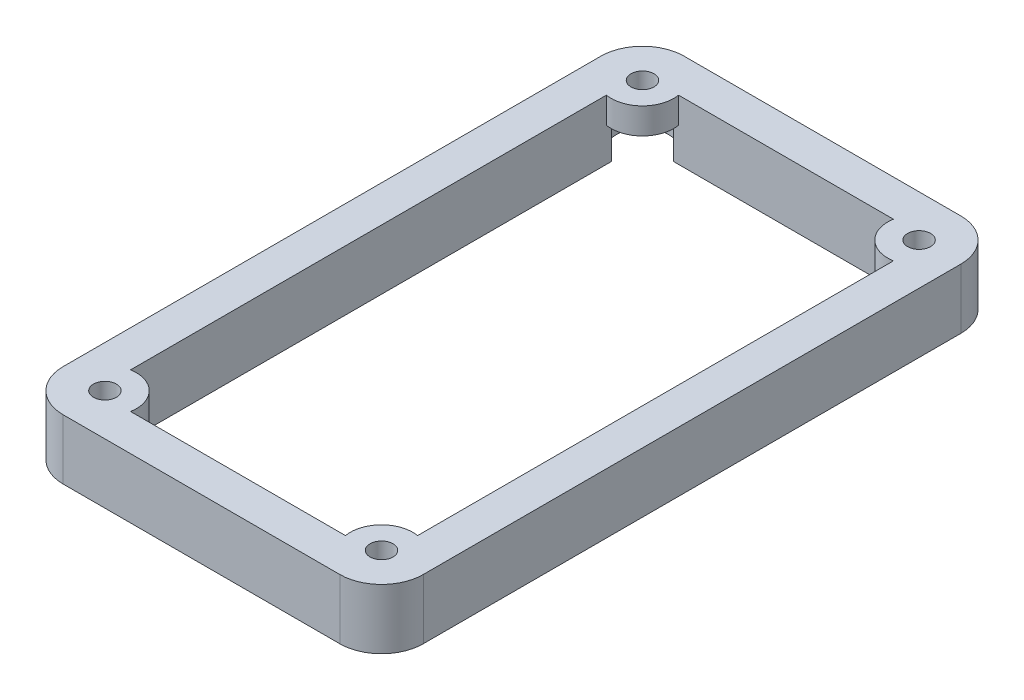
ISO-10303-21;
HEADER;
FILE_DESCRIPTION(('STEP AP214'),'2;1');
FILE_NAME('part.step','',(''),(''),'','','');
FILE_SCHEMA(('AUTOMOTIVE_DESIGN { 1 0 10303 214 1 1 1 1 }'));
ENDSEC;
DATA;
#1=APPLICATION_CONTEXT('core data for automotive mechanical design processes');
#2=APPLICATION_PROTOCOL_DEFINITION('international standard','automotive_design',2000,#1);
#3=PRODUCT_CONTEXT('',#1,'mechanical');
#4=PRODUCT('Part','Part','',(#3));
#5=PRODUCT_RELATED_PRODUCT_CATEGORY('part','',(#4));
#6=PRODUCT_DEFINITION_FORMATION('','',#4);
#7=PRODUCT_DEFINITION_CONTEXT('part definition',#1,'design');
#8=PRODUCT_DEFINITION('design','',#6,#7);
#9=PRODUCT_DEFINITION_SHAPE('','',#8);
#10=(LENGTH_UNIT() NAMED_UNIT(*) SI_UNIT(.MILLI.,.METRE.));
#11=(NAMED_UNIT(*) PLANE_ANGLE_UNIT() SI_UNIT($,.RADIAN.));
#12=(NAMED_UNIT(*) SI_UNIT($,.STERADIAN.) SOLID_ANGLE_UNIT());
#13=UNCERTAINTY_MEASURE_WITH_UNIT(LENGTH_MEASURE(1.E-05),#10,'distance_accuracy_value','');
#14=(GEOMETRIC_REPRESENTATION_CONTEXT(3) GLOBAL_UNCERTAINTY_ASSIGNED_CONTEXT((#13)) GLOBAL_UNIT_ASSIGNED_CONTEXT((#10,
#11,#12)) REPRESENTATION_CONTEXT('',''));
#15=CARTESIAN_POINT('',(0.,0.,0.));
#16=DIRECTION('',(0.,0.,1.));
#17=DIRECTION('',(1.,0.,0.));
#18=AXIS2_PLACEMENT_3D('',#15,#16,#17);
#19=CARTESIAN_POINT('',(-26.5,0.,-51.5));
#20=DIRECTION('',(0.,1.,0.));
#21=DIRECTION('',(0.,0.,1.));
#22=AXIS2_PLACEMENT_3D('',#19,#20,#21);
#23=CYLINDRICAL_SURFACE('',#22,2.2);
#24=CARTESIAN_POINT('',(-26.5,23.,-51.5));
#25=DIRECTION('',(0.,1.,0.));
#26=DIRECTION('',(0.,0.,1.));
#27=AXIS2_PLACEMENT_3D('',#24,#25,#26);
#28=CIRCLE('',#27,2.2);
#29=CARTESIAN_POINT('',(-26.5,23.,-49.3));
#30=VERTEX_POINT('',#29);
#31=EDGE_CURVE('E400',#30,#30,#28,.T.);
#32=ORIENTED_EDGE('',*,*,#31,.T.);
#33=EDGE_LOOP('',(#32));
#34=FACE_BOUND('',#33,.T.);
#35=CARTESIAN_POINT('',(-26.5,18.,-51.5));
#36=DIRECTION('',(0.,1.,0.));
#37=DIRECTION('',(0.,0.,1.));
#38=AXIS2_PLACEMENT_3D('',#35,#36,#37);
#39=CIRCLE('',#38,2.2);
#40=CARTESIAN_POINT('',(-26.5,18.,-49.3));
#41=VERTEX_POINT('',#40);
#42=EDGE_CURVE('E375',#41,#41,#39,.F.);
#43=ORIENTED_EDGE('',*,*,#42,.T.);
#44=EDGE_LOOP('',(#43));
#45=FACE_BOUND('',#44,.T.);
#46=ADVANCED_FACE('F45',(#34,#45),#23,.F.);
#47=CARTESIAN_POINT('',(26.5,0.,-51.5));
#48=DIRECTION('',(0.,1.,0.));
#49=DIRECTION('',(0.,0.,1.));
#50=AXIS2_PLACEMENT_3D('',#47,#48,#49);
#51=CYLINDRICAL_SURFACE('',#50,2.2);
#52=CARTESIAN_POINT('',(26.5,23.,-51.5));
#53=DIRECTION('',(0.,1.,0.));
#54=DIRECTION('',(0.,0.,1.));
#55=AXIS2_PLACEMENT_3D('',#52,#53,#54);
#56=CIRCLE('',#55,2.2);
#57=CARTESIAN_POINT('',(26.5,23.,-49.3));
#58=VERTEX_POINT('',#57);
#59=EDGE_CURVE('E396',#58,#58,#56,.T.);
#60=ORIENTED_EDGE('',*,*,#59,.T.);
#61=EDGE_LOOP('',(#60));
#62=FACE_BOUND('',#61,.T.);
#63=CARTESIAN_POINT('',(26.5,18.,-51.5));
#64=DIRECTION('',(0.,1.,0.));
#65=DIRECTION('',(0.,0.,1.));
#66=AXIS2_PLACEMENT_3D('',#63,#64,#65);
#67=CIRCLE('',#66,2.2);
#68=CARTESIAN_POINT('',(26.5,18.,-49.3));
#69=VERTEX_POINT('',#68);
#70=EDGE_CURVE('E371',#69,#69,#67,.F.);
#71=ORIENTED_EDGE('',*,*,#70,.T.);
#72=EDGE_LOOP('',(#71));
#73=FACE_BOUND('',#72,.T.);
#74=ADVANCED_FACE('F579',(#62,#73),#51,.F.);
#75=CARTESIAN_POINT('',(26.5,0.,51.5));
#76=DIRECTION('',(0.,1.,0.));
#77=DIRECTION('',(0.,0.,1.));
#78=AXIS2_PLACEMENT_3D('',#75,#76,#77);
#79=CYLINDRICAL_SURFACE('',#78,2.2);
#80=CARTESIAN_POINT('',(26.5,23.,51.5));
#81=DIRECTION('',(0.,1.,0.));
#82=DIRECTION('',(0.,0.,1.));
#83=AXIS2_PLACEMENT_3D('',#80,#81,#82);
#84=CIRCLE('',#83,2.2);
#85=CARTESIAN_POINT('',(26.5,23.,53.7));
#86=VERTEX_POINT('',#85);
#87=EDGE_CURVE('E401',#86,#86,#84,.T.);
#88=ORIENTED_EDGE('',*,*,#87,.T.);
#89=EDGE_LOOP('',(#88));
#90=FACE_BOUND('',#89,.T.);
#91=CARTESIAN_POINT('',(26.5,18.,51.5));
#92=DIRECTION('',(0.,1.,0.));
#93=DIRECTION('',(0.,0.,1.));
#94=AXIS2_PLACEMENT_3D('',#91,#92,#93);
#95=CIRCLE('',#94,2.2);
#96=CARTESIAN_POINT('',(26.5,18.,53.7));
#97=VERTEX_POINT('',#96);
#98=EDGE_CURVE('E367',#97,#97,#95,.F.);
#99=ORIENTED_EDGE('',*,*,#98,.T.);
#100=EDGE_LOOP('',(#99));
#101=FACE_BOUND('',#100,.T.);
#102=ADVANCED_FACE('F586',(#90,#101),#79,.F.);
#103=CARTESIAN_POINT('',(-26.5,0.,51.5));
#104=DIRECTION('',(0.,1.,0.));
#105=DIRECTION('',(0.,0.,1.));
#106=AXIS2_PLACEMENT_3D('',#103,#104,#105);
#107=CYLINDRICAL_SURFACE('',#106,2.2);
#108=CARTESIAN_POINT('',(-26.5,23.,51.5));
#109=DIRECTION('',(0.,1.,0.));
#110=DIRECTION('',(0.,0.,1.));
#111=AXIS2_PLACEMENT_3D('',#108,#109,#110);
#112=CIRCLE('',#111,2.2);
#113=CARTESIAN_POINT('',(-26.5,23.,53.7));
#114=VERTEX_POINT('',#113);
#115=EDGE_CURVE('E395',#114,#114,#112,.T.);
#116=ORIENTED_EDGE('',*,*,#115,.T.);
#117=EDGE_LOOP('',(#116));
#118=FACE_BOUND('',#117,.T.);
#119=CARTESIAN_POINT('',(-26.5,18.,51.5));
#120=DIRECTION('',(0.,1.,0.));
#121=DIRECTION('',(0.,0.,1.));
#122=AXIS2_PLACEMENT_3D('',#119,#120,#121);
#123=CIRCLE('',#122,2.2);
#124=CARTESIAN_POINT('',(-26.5,18.,53.7));
#125=VERTEX_POINT('',#124);
#126=EDGE_CURVE('E471',#125,#125,#123,.F.);
#127=ORIENTED_EDGE('',*,*,#126,.T.);
#128=EDGE_LOOP('',(#127));
#129=FACE_BOUND('',#128,.T.);
#130=ADVANCED_FACE('F592',(#118,#129),#107,.F.);
#131=CARTESIAN_POINT('',(27.5,23.,-52.5));
#132=DIRECTION('',(-1.,0.,0.));
#133=DIRECTION('',(0.,0.,1.));
#134=AXIS2_PLACEMENT_3D('',#131,#132,#133);
#135=PLANE('',#134);
#136=DIRECTION('',(0.,0.,-1.));
#137=VECTOR('',#136,1.);
#138=CARTESIAN_POINT('',(27.5,11.5,-52.5));
#139=LINE('',#138,#137);
#140=CARTESIAN_POINT('',(27.5,11.5,46.6010205144337));
#141=VERTEX_POINT('',#140);
#142=CARTESIAN_POINT('',(27.5,11.5,-46.6010205144337));
#143=VERTEX_POINT('',#142);
#144=EDGE_CURVE('E339',#141,#143,#139,.T.);
#145=ORIENTED_EDGE('',*,*,#144,.F.);
#146=DIRECTION('',(0.,1.,0.));
#147=VECTOR('',#146,1.);
#148=CARTESIAN_POINT('',(27.5,-2.64213562373094,46.6010205144337));
#149=LINE('',#148,#147);
#150=CARTESIAN_POINT('',(27.5,18.,46.6010205144337));
#151=VERTEX_POINT('',#150);
#152=EDGE_CURVE('E61',#141,#151,#149,.T.);
#153=ORIENTED_EDGE('',*,*,#152,.T.);
#154=DIRECTION('',(0.,0.,-1.));
#155=VECTOR('',#154,1.);
#156=CARTESIAN_POINT('',(27.5,18.,52.5));
#157=LINE('',#156,#155);
#158=CARTESIAN_POINT('',(27.5,18.,45.5839202169004));
#159=VERTEX_POINT('',#158);
#160=EDGE_CURVE('E361',#151,#159,#157,.T.);
#161=ORIENTED_EDGE('',*,*,#160,.T.);
#162=DIRECTION('',(0.,1.,0.));
#163=VECTOR('',#162,1.);
#164=CARTESIAN_POINT('',(27.5,-16.9705627484771,45.5839202169004));
#165=LINE('',#164,#163);
#166=CARTESIAN_POINT('',(27.5,23.,45.5839202169004));
#167=VERTEX_POINT('',#166);
#168=EDGE_CURVE('E427',#167,#159,#165,.F.);
#169=ORIENTED_EDGE('',*,*,#168,.F.);
#170=DIRECTION('',(0.,0.,-1.));
#171=VECTOR('',#170,1.);
#172=CARTESIAN_POINT('',(27.5,23.,-52.5));
#173=LINE('',#172,#171);
#174=CARTESIAN_POINT('',(27.5,23.,-45.5839202169004));
#175=VERTEX_POINT('',#174);
#176=EDGE_CURVE('E440',#167,#175,#173,.T.);
#177=ORIENTED_EDGE('',*,*,#176,.T.);
#178=DIRECTION('',(0.,1.,0.));
#179=VECTOR('',#178,1.);
#180=CARTESIAN_POINT('',(27.5,-16.9705627484771,-45.5839202169004));
#181=LINE('',#180,#179);
#182=CARTESIAN_POINT('',(27.5,18.,-45.5839202169004));
#183=VERTEX_POINT('',#182);
#184=EDGE_CURVE('E437',#183,#175,#181,.T.);
#185=ORIENTED_EDGE('',*,*,#184,.F.);
#186=CARTESIAN_POINT('',(27.5,18.,-46.6010205144337));
#187=VERTEX_POINT('',#186);
#188=EDGE_CURVE('E357',#183,#187,#157,.T.);
#189=ORIENTED_EDGE('',*,*,#188,.T.);
#190=DIRECTION('',(0.,1.,0.));
#191=VECTOR('',#190,1.);
#192=CARTESIAN_POINT('',(27.5,-2.64213562373094,-46.6010205144337));
#193=LINE('',#192,#191);
#194=EDGE_CURVE('E315',#187,#143,#193,.F.);
#195=ORIENTED_EDGE('',*,*,#194,.T.);
#196=EDGE_LOOP('',(#145,#153,#161,#169,#177,#185,#189,#195));
#197=FACE_BOUND('',#196,.T.);
#198=ADVANCED_FACE('F509',(#197),#135,.T.);
#199=CARTESIAN_POINT('',(-27.5,23.,-52.5));
#200=DIRECTION('',(0.,0.,1.));
#201=DIRECTION('',(1.,0.,0.));
#202=AXIS2_PLACEMENT_3D('',#199,#200,#201);
#203=PLANE('',#202);
#204=DIRECTION('',(-1.,0.,0.));
#205=VECTOR('',#204,1.);
#206=CARTESIAN_POINT('',(-27.5,11.5,-52.5));
#207=LINE('',#206,#205);
#208=CARTESIAN_POINT('',(21.6010205144336,11.5,-52.5));
#209=VERTEX_POINT('',#208);
#210=CARTESIAN_POINT('',(-21.6010205144336,11.5,-52.5));
#211=VERTEX_POINT('',#210);
#212=EDGE_CURVE('E343',#209,#211,#207,.T.);
#213=ORIENTED_EDGE('',*,*,#212,.F.);
#214=DIRECTION('',(0.,1.,0.));
#215=VECTOR('',#214,1.);
#216=CARTESIAN_POINT('',(21.6010205144336,-2.64213562373094,-52.5));
#217=LINE('',#216,#215);
#218=CARTESIAN_POINT('',(21.6010205144336,18.,-52.5));
#219=VERTEX_POINT('',#218);
#220=EDGE_CURVE('E311',#209,#219,#217,.T.);
#221=ORIENTED_EDGE('',*,*,#220,.T.);
#222=DIRECTION('',(-1.,0.,0.));
#223=VECTOR('',#222,1.);
#224=CARTESIAN_POINT('',(27.5,18.,-52.5));
#225=LINE('',#224,#223);
#226=CARTESIAN_POINT('',(20.5839202169004,18.,-52.5));
#227=VERTEX_POINT('',#226);
#228=EDGE_CURVE('E366',#219,#227,#225,.T.);
#229=ORIENTED_EDGE('',*,*,#228,.T.);
#230=DIRECTION('',(0.,1.,0.));
#231=VECTOR('',#230,1.);
#232=CARTESIAN_POINT('',(20.5839202169004,-16.9705627484771,-52.5));
#233=LINE('',#232,#231);
#234=CARTESIAN_POINT('',(20.5839202169004,23.,-52.5));
#235=VERTEX_POINT('',#234);
#236=EDGE_CURVE('E467',#235,#227,#233,.F.);
#237=ORIENTED_EDGE('',*,*,#236,.F.);
#238=DIRECTION('',(-1.,0.,0.));
#239=VECTOR('',#238,1.);
#240=CARTESIAN_POINT('',(-27.5,23.,-52.5));
#241=LINE('',#240,#239);
#242=CARTESIAN_POINT('',(-20.5839202169004,23.,-52.5));
#243=VERTEX_POINT('',#242);
#244=EDGE_CURVE('E444',#235,#243,#241,.T.);
#245=ORIENTED_EDGE('',*,*,#244,.T.);
#246=DIRECTION('',(0.,1.,0.));
#247=VECTOR('',#246,1.);
#248=CARTESIAN_POINT('',(-20.5839202169004,-16.9705627484771,-52.5));
#249=LINE('',#248,#247);
#250=CARTESIAN_POINT('',(-20.5839202169004,18.,-52.5));
#251=VERTEX_POINT('',#250);
#252=EDGE_CURVE('E434',#251,#243,#249,.T.);
#253=ORIENTED_EDGE('',*,*,#252,.F.);
#254=CARTESIAN_POINT('',(-21.6010205144336,18.,-52.5));
#255=VERTEX_POINT('',#254);
#256=EDGE_CURVE('E362',#251,#255,#225,.T.);
#257=ORIENTED_EDGE('',*,*,#256,.T.);
#258=DIRECTION('',(0.,1.,0.));
#259=VECTOR('',#258,1.);
#260=CARTESIAN_POINT('',(-21.6010205144336,-2.64213562373094,-52.5));
#261=LINE('',#260,#259);
#262=EDGE_CURVE('E307',#255,#211,#261,.F.);
#263=ORIENTED_EDGE('',*,*,#262,.T.);
#264=EDGE_LOOP('',(#213,#221,#229,#237,#245,#253,#257,#263));
#265=FACE_BOUND('',#264,.T.);
#266=ADVANCED_FACE('F513',(#265),#203,.T.);
#267=CARTESIAN_POINT('',(-27.5,23.,-52.5));
#268=DIRECTION('',(1.,0.,0.));
#269=DIRECTION('',(0.,0.,-1.));
#270=AXIS2_PLACEMENT_3D('',#267,#268,#269);
#271=PLANE('',#270);
#272=DIRECTION('',(0.,0.,1.));
#273=VECTOR('',#272,1.);
#274=CARTESIAN_POINT('',(-27.5,18.,52.5));
#275=LINE('',#274,#273);
#276=CARTESIAN_POINT('',(-27.5,18.,45.5839202169004));
#277=VERTEX_POINT('',#276);
#278=CARTESIAN_POINT('',(-27.5,18.,46.6010205144337));
#279=VERTEX_POINT('',#278);
#280=EDGE_CURVE('E347',#277,#279,#275,.T.);
#281=ORIENTED_EDGE('',*,*,#280,.T.);
#282=DIRECTION('',(0.,1.,0.));
#283=VECTOR('',#282,1.);
#284=CARTESIAN_POINT('',(-27.5,-2.64213562373094,46.6010205144337));
#285=LINE('',#284,#283);
#286=CARTESIAN_POINT('',(-27.5,11.5,46.6010205144337));
#287=VERTEX_POINT('',#286);
#288=EDGE_CURVE('E327',#279,#287,#285,.F.);
#289=ORIENTED_EDGE('',*,*,#288,.T.);
#290=DIRECTION('',(0.,0.,1.));
#291=VECTOR('',#290,1.);
#292=CARTESIAN_POINT('',(-27.5,11.5,-52.5));
#293=LINE('',#292,#291);
#294=CARTESIAN_POINT('',(-27.5,11.5,-46.6010205144337));
#295=VERTEX_POINT('',#294);
#296=EDGE_CURVE('E335',#295,#287,#293,.T.);
#297=ORIENTED_EDGE('',*,*,#296,.F.);
#298=DIRECTION('',(0.,1.,0.));
#299=VECTOR('',#298,1.);
#300=CARTESIAN_POINT('',(-27.5,-2.64213562373094,-46.6010205144337));
#301=LINE('',#300,#299);
#302=CARTESIAN_POINT('',(-27.5,18.,-46.6010205144337));
#303=VERTEX_POINT('',#302);
#304=EDGE_CURVE('E303',#295,#303,#301,.T.);
#305=ORIENTED_EDGE('',*,*,#304,.T.);
#306=CARTESIAN_POINT('',(-27.5,18.,-45.5839202169004));
#307=VERTEX_POINT('',#306);
#308=EDGE_CURVE('E351',#303,#307,#275,.T.);
#309=ORIENTED_EDGE('',*,*,#308,.T.);
#310=DIRECTION('',(0.,1.,0.));
#311=VECTOR('',#310,1.);
#312=CARTESIAN_POINT('',(-27.5,-16.9705627484771,-45.5839202169004));
#313=LINE('',#312,#311);
#314=CARTESIAN_POINT('',(-27.5,23.,-45.5839202169004));
#315=VERTEX_POINT('',#314);
#316=EDGE_CURVE('E463',#315,#307,#313,.F.);
#317=ORIENTED_EDGE('',*,*,#316,.F.);
#318=DIRECTION('',(0.,0.,1.));
#319=VECTOR('',#318,1.);
#320=CARTESIAN_POINT('',(-27.5,23.,-52.5));
#321=LINE('',#320,#319);
#322=CARTESIAN_POINT('',(-27.5,23.,45.5839202169004));
#323=VERTEX_POINT('',#322);
#324=EDGE_CURVE('E448',#315,#323,#321,.T.);
#325=ORIENTED_EDGE('',*,*,#324,.T.);
#326=DIRECTION('',(0.,1.,0.));
#327=VECTOR('',#326,1.);
#328=CARTESIAN_POINT('',(-27.5,-16.9705627484771,45.5839202169004));
#329=LINE('',#328,#327);
#330=EDGE_CURVE('E431',#277,#323,#329,.T.);
#331=ORIENTED_EDGE('',*,*,#330,.F.);
#332=EDGE_LOOP('',(#281,#289,#297,#305,#309,#317,#325,#331));
#333=FACE_BOUND('',#332,.T.);
#334=ADVANCED_FACE('F487',(#333),#271,.T.);
#335=CARTESIAN_POINT('',(-27.5,23.,52.5));
#336=DIRECTION('',(0.,0.,-1.));
#337=DIRECTION('',(-1.,0.,0.));
#338=AXIS2_PLACEMENT_3D('',#335,#336,#337);
#339=PLANE('',#338);
#340=DIRECTION('',(1.,0.,0.));
#341=VECTOR('',#340,1.);
#342=CARTESIAN_POINT('',(-27.5,11.5,52.5));
#343=LINE('',#342,#341);
#344=CARTESIAN_POINT('',(-21.6010205144336,11.5,52.5));
#345=VERTEX_POINT('',#344);
#346=CARTESIAN_POINT('',(21.6010205144336,11.5,52.5));
#347=VERTEX_POINT('',#346);
#348=EDGE_CURVE('E331',#345,#347,#343,.T.);
#349=ORIENTED_EDGE('',*,*,#348,.F.);
#350=DIRECTION('',(0.,1.,0.));
#351=VECTOR('',#350,1.);
#352=CARTESIAN_POINT('',(-21.6010205144336,-2.64213562373094,52.5));
#353=LINE('',#352,#351);
#354=CARTESIAN_POINT('',(-21.6010205144336,18.,52.5));
#355=VERTEX_POINT('',#354);
#356=EDGE_CURVE('E68',#345,#355,#353,.T.);
#357=ORIENTED_EDGE('',*,*,#356,.T.);
#358=DIRECTION('',(1.,0.,0.));
#359=VECTOR('',#358,1.);
#360=CARTESIAN_POINT('',(27.5,18.,52.5));
#361=LINE('',#360,#359);
#362=CARTESIAN_POINT('',(-20.5839202169004,18.,52.5));
#363=VERTEX_POINT('',#362);
#364=EDGE_CURVE('E356',#355,#363,#361,.T.);
#365=ORIENTED_EDGE('',*,*,#364,.T.);
#366=DIRECTION('',(0.,1.,0.));
#367=VECTOR('',#366,1.);
#368=CARTESIAN_POINT('',(-20.5839202169004,-16.9705627484771,52.5));
#369=LINE('',#368,#367);
#370=CARTESIAN_POINT('',(-20.5839202169004,23.,52.5));
#371=VERTEX_POINT('',#370);
#372=EDGE_CURVE('E459',#371,#363,#369,.F.);
#373=ORIENTED_EDGE('',*,*,#372,.F.);
#374=DIRECTION('',(1.,0.,0.));
#375=VECTOR('',#374,1.);
#376=CARTESIAN_POINT('',(-27.5,23.,52.5));
#377=LINE('',#376,#375);
#378=CARTESIAN_POINT('',(20.5839202169004,23.,52.5));
#379=VERTEX_POINT('',#378);
#380=EDGE_CURVE('E452',#371,#379,#377,.T.);
#381=ORIENTED_EDGE('',*,*,#380,.T.);
#382=DIRECTION('',(0.,1.,0.));
#383=VECTOR('',#382,1.);
#384=CARTESIAN_POINT('',(20.5839202169004,-16.9705627484771,52.5));
#385=LINE('',#384,#383);
#386=CARTESIAN_POINT('',(20.5839202169004,18.,52.5));
#387=VERTEX_POINT('',#386);
#388=EDGE_CURVE('E456',#387,#379,#385,.T.);
#389=ORIENTED_EDGE('',*,*,#388,.F.);
#390=CARTESIAN_POINT('',(21.6010205144336,18.,52.5));
#391=VERTEX_POINT('',#390);
#392=EDGE_CURVE('E352',#387,#391,#361,.T.);
#393=ORIENTED_EDGE('',*,*,#392,.T.);
#394=DIRECTION('',(0.,1.,0.));
#395=VECTOR('',#394,1.);
#396=CARTESIAN_POINT('',(21.6010205144336,-2.64213562373094,52.5));
#397=LINE('',#396,#395);
#398=EDGE_CURVE('E319',#391,#347,#397,.F.);
#399=ORIENTED_EDGE('',*,*,#398,.T.);
#400=EDGE_LOOP('',(#349,#357,#365,#373,#381,#389,#393,#399));
#401=FACE_BOUND('',#400,.T.);
#402=ADVANCED_FACE('F480',(#401),#339,.T.);
#403=CARTESIAN_POINT('',(0.,23.,0.));
#404=DIRECTION('',(0.,-1.,0.));
#405=DIRECTION('',(0.,0.,-1.));
#406=AXIS2_PLACEMENT_3D('',#403,#404,#405);
#407=PLANE('',#406);
#408=ORIENTED_EDGE('',*,*,#115,.F.);
#409=EDGE_LOOP('',(#408));
#410=FACE_BOUND('',#409,.T.);
#411=ORIENTED_EDGE('',*,*,#87,.F.);
#412=EDGE_LOOP('',(#411));
#413=FACE_BOUND('',#412,.T.);
#414=ORIENTED_EDGE('',*,*,#59,.F.);
#415=EDGE_LOOP('',(#414));
#416=FACE_BOUND('',#415,.T.);
#417=ORIENTED_EDGE('',*,*,#31,.F.);
#418=EDGE_LOOP('',(#417));
#419=FACE_BOUND('',#418,.T.);
#420=CARTESIAN_POINT('',(26.5,23.,-51.5));
#421=DIRECTION('',(0.,1.,0.));
#422=DIRECTION('',(0.,0.,1.));
#423=AXIS2_PLACEMENT_3D('',#420,#421,#422);
#424=CIRCLE('',#423,5.99999999999999);
#425=EDGE_CURVE('E416',#235,#175,#424,.T.);
#426=ORIENTED_EDGE('',*,*,#425,.T.);
#427=ORIENTED_EDGE('',*,*,#176,.F.);
#428=CARTESIAN_POINT('',(26.5,23.,51.5));
#429=DIRECTION('',(0.,1.,0.));
#430=DIRECTION('',(0.,0.,1.));
#431=AXIS2_PLACEMENT_3D('',#428,#429,#430);
#432=CIRCLE('',#431,5.99999999999999);
#433=EDGE_CURVE('E411',#167,#379,#432,.T.);
#434=ORIENTED_EDGE('',*,*,#433,.T.);
#435=ORIENTED_EDGE('',*,*,#380,.F.);
#436=CARTESIAN_POINT('',(-26.5,23.,51.5));
#437=DIRECTION('',(0.,1.,0.));
#438=DIRECTION('',(0.,0.,1.));
#439=AXIS2_PLACEMENT_3D('',#436,#437,#438);
#440=CIRCLE('',#439,6.);
#441=EDGE_CURVE('E415',#371,#323,#440,.T.);
#442=ORIENTED_EDGE('',*,*,#441,.T.);
#443=ORIENTED_EDGE('',*,*,#324,.F.);
#444=CARTESIAN_POINT('',(-26.5,23.,-51.5));
#445=DIRECTION('',(0.,1.,0.));
#446=DIRECTION('',(0.,0.,1.));
#447=AXIS2_PLACEMENT_3D('',#444,#445,#446);
#448=CIRCLE('',#447,6.);
#449=EDGE_CURVE('E420',#315,#243,#448,.T.);
#450=ORIENTED_EDGE('',*,*,#449,.T.);
#451=ORIENTED_EDGE('',*,*,#244,.F.);
#452=EDGE_LOOP('',(#426,#427,#434,#435,#442,#443,#450,#451));
#453=FACE_BOUND('',#452,.T.);
#454=CARTESIAN_POINT('',(-26.5,23.,51.5));
#455=DIRECTION('',(0.,1.,0.));
#456=DIRECTION('',(0.,0.,1.));
#457=AXIS2_PLACEMENT_3D('',#454,#455,#456);
#458=CIRCLE('',#457,8.);
#459=CARTESIAN_POINT('',(-34.5,23.,51.5));
#460=VERTEX_POINT('',#459);
#461=CARTESIAN_POINT('',(-26.5,23.,59.5));
#462=VERTEX_POINT('',#461);
#463=EDGE_CURVE('E212',#460,#462,#458,.T.);
#464=ORIENTED_EDGE('',*,*,#463,.T.);
#465=DIRECTION('',(1.,0.,0.));
#466=VECTOR('',#465,1.);
#467=CARTESIAN_POINT('',(-26.5,23.,59.5));
#468=LINE('',#467,#466);
#469=CARTESIAN_POINT('',(26.5,23.,59.5));
#470=VERTEX_POINT('',#469);
#471=EDGE_CURVE('E222',#462,#470,#468,.T.);
#472=ORIENTED_EDGE('',*,*,#471,.T.);
#473=CARTESIAN_POINT('',(26.5,23.,51.5));
#474=DIRECTION('',(0.,1.,0.));
#475=DIRECTION('',(0.,0.,1.));
#476=AXIS2_PLACEMENT_3D('',#473,#474,#475);
#477=CIRCLE('',#476,8.);
#478=CARTESIAN_POINT('',(34.5,23.,51.5));
#479=VERTEX_POINT('',#478);
#480=EDGE_CURVE('E229',#470,#479,#477,.T.);
#481=ORIENTED_EDGE('',*,*,#480,.T.);
#482=DIRECTION('',(0.,0.,-1.));
#483=VECTOR('',#482,1.);
#484=CARTESIAN_POINT('',(34.5,23.,51.5));
#485=LINE('',#484,#483);
#486=CARTESIAN_POINT('',(34.5,23.,-51.5));
#487=VERTEX_POINT('',#486);
#488=EDGE_CURVE('E240',#479,#487,#485,.T.);
#489=ORIENTED_EDGE('',*,*,#488,.T.);
#490=CARTESIAN_POINT('',(26.5,23.,-51.5));
#491=DIRECTION('',(0.,1.,0.));
#492=DIRECTION('',(0.,0.,1.));
#493=AXIS2_PLACEMENT_3D('',#490,#491,#492);
#494=CIRCLE('',#493,8.);
#495=CARTESIAN_POINT('',(26.5,23.,-59.5));
#496=VERTEX_POINT('',#495);
#497=EDGE_CURVE('E244',#487,#496,#494,.T.);
#498=ORIENTED_EDGE('',*,*,#497,.T.);
#499=DIRECTION('',(-1.,0.,0.));
#500=VECTOR('',#499,1.);
#501=CARTESIAN_POINT('',(26.5,23.,-59.5));
#502=LINE('',#501,#500);
#503=CARTESIAN_POINT('',(-26.5,23.,-59.5));
#504=VERTEX_POINT('',#503);
#505=EDGE_CURVE('E248',#496,#504,#502,.T.);
#506=ORIENTED_EDGE('',*,*,#505,.T.);
#507=CARTESIAN_POINT('',(-26.5,23.,-51.5));
#508=DIRECTION('',(0.,1.,0.));
#509=DIRECTION('',(0.,0.,1.));
#510=AXIS2_PLACEMENT_3D('',#507,#508,#509);
#511=CIRCLE('',#510,7.99999999999999);
#512=CARTESIAN_POINT('',(-34.5,23.,-51.5));
#513=VERTEX_POINT('',#512);
#514=EDGE_CURVE('E252',#504,#513,#511,.T.);
#515=ORIENTED_EDGE('',*,*,#514,.T.);
#516=DIRECTION('',(0.,0.,1.));
#517=VECTOR('',#516,1.);
#518=CARTESIAN_POINT('',(-34.5,23.,-51.5));
#519=LINE('',#518,#517);
#520=EDGE_CURVE('E219',#513,#460,#519,.T.);
#521=ORIENTED_EDGE('',*,*,#520,.T.);
#522=EDGE_LOOP('',(#464,#472,#481,#489,#498,#506,#515,#521));
#523=FACE_BOUND('',#522,.T.);
#524=ADVANCED_FACE('F47',(#410,#413,#416,#419,#453,#523),#407,.F.);
#525=CARTESIAN_POINT('',(26.5,-16.9705627484771,51.5));
#526=DIRECTION('',(0.,1.,0.));
#527=DIRECTION('',(0.,0.,1.));
#528=AXIS2_PLACEMENT_3D('',#525,#526,#527);
#529=CYLINDRICAL_SURFACE('',#528,5.99999999999999);
#530=CARTESIAN_POINT('',(26.5,18.,51.5));
#531=DIRECTION('',(0.,1.,0.));
#532=DIRECTION('',(0.,0.,1.));
#533=AXIS2_PLACEMENT_3D('',#530,#531,#532);
#534=CIRCLE('',#533,5.99999999999999);
#535=EDGE_CURVE('E391',#387,#159,#534,.F.);
#536=ORIENTED_EDGE('',*,*,#535,.F.);
#537=ORIENTED_EDGE('',*,*,#388,.T.);
#538=ORIENTED_EDGE('',*,*,#433,.F.);
#539=ORIENTED_EDGE('',*,*,#168,.T.);
#540=EDGE_LOOP('',(#536,#537,#538,#539));
#541=FACE_BOUND('',#540,.T.);
#542=ADVANCED_FACE('F503',(#541),#529,.T.);
#543=CARTESIAN_POINT('',(-26.5,-16.9705627484771,51.5));
#544=DIRECTION('',(0.,1.,0.));
#545=DIRECTION('',(0.,0.,1.));
#546=AXIS2_PLACEMENT_3D('',#543,#544,#545);
#547=CYLINDRICAL_SURFACE('',#546,6.);
#548=CARTESIAN_POINT('',(-26.5,18.,51.5));
#549=DIRECTION('',(0.,1.,0.));
#550=DIRECTION('',(0.,0.,1.));
#551=AXIS2_PLACEMENT_3D('',#548,#549,#550);
#552=CIRCLE('',#551,6.);
#553=EDGE_CURVE('E387',#277,#363,#552,.F.);
#554=ORIENTED_EDGE('',*,*,#553,.F.);
#555=ORIENTED_EDGE('',*,*,#330,.T.);
#556=ORIENTED_EDGE('',*,*,#441,.F.);
#557=ORIENTED_EDGE('',*,*,#372,.T.);
#558=EDGE_LOOP('',(#554,#555,#556,#557));
#559=FACE_BOUND('',#558,.T.);
#560=ADVANCED_FACE('F494',(#559),#547,.T.);
#561=CARTESIAN_POINT('',(-26.5,-16.9705627484771,-51.5));
#562=DIRECTION('',(0.,1.,0.));
#563=DIRECTION('',(0.,0.,1.));
#564=AXIS2_PLACEMENT_3D('',#561,#562,#563);
#565=CYLINDRICAL_SURFACE('',#564,6.);
#566=CARTESIAN_POINT('',(-26.5,18.,-51.5));
#567=DIRECTION('',(0.,1.,0.));
#568=DIRECTION('',(0.,0.,1.));
#569=AXIS2_PLACEMENT_3D('',#566,#567,#568);
#570=CIRCLE('',#569,6.);
#571=EDGE_CURVE('E383',#251,#307,#570,.F.);
#572=ORIENTED_EDGE('',*,*,#571,.F.);
#573=ORIENTED_EDGE('',*,*,#252,.T.);
#574=ORIENTED_EDGE('',*,*,#449,.F.);
#575=ORIENTED_EDGE('',*,*,#316,.T.);
#576=EDGE_LOOP('',(#572,#573,#574,#575));
#577=FACE_BOUND('',#576,.T.);
#578=ADVANCED_FACE('F598',(#577),#565,.T.);
#579=CARTESIAN_POINT('',(26.5,-16.9705627484771,-51.5));
#580=DIRECTION('',(0.,1.,0.));
#581=DIRECTION('',(0.,0.,1.));
#582=AXIS2_PLACEMENT_3D('',#579,#580,#581);
#583=CYLINDRICAL_SURFACE('',#582,5.99999999999999);
#584=CARTESIAN_POINT('',(26.5,18.,-51.5));
#585=DIRECTION('',(0.,1.,0.));
#586=DIRECTION('',(0.,0.,1.));
#587=AXIS2_PLACEMENT_3D('',#584,#585,#586);
#588=CIRCLE('',#587,5.99999999999999);
#589=EDGE_CURVE('E379',#183,#227,#588,.F.);
#590=ORIENTED_EDGE('',*,*,#589,.F.);
#591=ORIENTED_EDGE('',*,*,#184,.T.);
#592=ORIENTED_EDGE('',*,*,#425,.F.);
#593=ORIENTED_EDGE('',*,*,#236,.T.);
#594=EDGE_LOOP('',(#590,#591,#592,#593));
#595=FACE_BOUND('',#594,.T.);
#596=ADVANCED_FACE('F596',(#595),#583,.T.);
#597=CARTESIAN_POINT('',(0.,18.,0.));
#598=DIRECTION('',(0.,1.,0.));
#599=DIRECTION('',(0.,0.,1.));
#600=AXIS2_PLACEMENT_3D('',#597,#598,#599);
#601=PLANE('',#600);
#602=ORIENTED_EDGE('',*,*,#126,.F.);
#603=EDGE_LOOP('',(#602));
#604=FACE_BOUND('',#603,.T.);
#605=ORIENTED_EDGE('',*,*,#364,.F.);
#606=CARTESIAN_POINT('',(-26.5,18.,51.5));
#607=DIRECTION('',(0.,-1.,0.));
#608=DIRECTION('',(0.,0.,-1.));
#609=AXIS2_PLACEMENT_3D('',#606,#607,#608);
#610=CIRCLE('',#609,5.);
#611=EDGE_CURVE('E291',#355,#279,#610,.T.);
#612=ORIENTED_EDGE('',*,*,#611,.T.);
#613=ORIENTED_EDGE('',*,*,#280,.F.);
#614=ORIENTED_EDGE('',*,*,#553,.T.);
#615=EDGE_LOOP('',(#605,#612,#613,#614));
#616=FACE_BOUND('',#615,.T.);
#617=ADVANCED_FACE('F492',(#604,#616),#601,.F.);
#618=ORIENTED_EDGE('',*,*,#160,.F.);
#619=CARTESIAN_POINT('',(26.5,18.,51.5));
#620=DIRECTION('',(0.,-1.,0.));
#621=DIRECTION('',(0.,0.,-1.));
#622=AXIS2_PLACEMENT_3D('',#619,#620,#621);
#623=CIRCLE('',#622,5.);
#624=EDGE_CURVE('E283',#151,#391,#623,.T.);
#625=ORIENTED_EDGE('',*,*,#624,.T.);
#626=ORIENTED_EDGE('',*,*,#392,.F.);
#627=ORIENTED_EDGE('',*,*,#535,.T.);
#628=EDGE_LOOP('',(#618,#625,#626,#627));
#629=FACE_BOUND('',#628,.T.);
#630=ORIENTED_EDGE('',*,*,#98,.F.);
#631=EDGE_LOOP('',(#630));
#632=FACE_BOUND('',#631,.T.);
#633=ADVANCED_FACE('F506',(#629,#632),#601,.F.);
#634=ORIENTED_EDGE('',*,*,#70,.F.);
#635=EDGE_LOOP('',(#634));
#636=FACE_BOUND('',#635,.T.);
#637=ORIENTED_EDGE('',*,*,#228,.F.);
#638=CARTESIAN_POINT('',(26.5,18.,-51.5));
#639=DIRECTION('',(0.,-1.,0.));
#640=DIRECTION('',(0.,0.,-1.));
#641=AXIS2_PLACEMENT_3D('',#638,#639,#640);
#642=CIRCLE('',#641,5.);
#643=EDGE_CURVE('E282',#219,#187,#642,.T.);
#644=ORIENTED_EDGE('',*,*,#643,.T.);
#645=ORIENTED_EDGE('',*,*,#188,.F.);
#646=ORIENTED_EDGE('',*,*,#589,.T.);
#647=EDGE_LOOP('',(#637,#644,#645,#646));
#648=FACE_BOUND('',#647,.T.);
#649=ADVANCED_FACE('F628',(#636,#648),#601,.F.);
#650=ORIENTED_EDGE('',*,*,#42,.F.);
#651=EDGE_LOOP('',(#650));
#652=FACE_BOUND('',#651,.T.);
#653=ORIENTED_EDGE('',*,*,#308,.F.);
#654=CARTESIAN_POINT('',(-26.5,18.,-51.5));
#655=DIRECTION('',(0.,-1.,0.));
#656=DIRECTION('',(0.,0.,-1.));
#657=AXIS2_PLACEMENT_3D('',#654,#655,#656);
#658=CIRCLE('',#657,5.);
#659=EDGE_CURVE('E287',#303,#255,#658,.T.);
#660=ORIENTED_EDGE('',*,*,#659,.T.);
#661=ORIENTED_EDGE('',*,*,#256,.F.);
#662=ORIENTED_EDGE('',*,*,#571,.T.);
#663=EDGE_LOOP('',(#653,#660,#661,#662));
#664=FACE_BOUND('',#663,.T.);
#665=ADVANCED_FACE('F520',(#652,#664),#601,.F.);
#666=CARTESIAN_POINT('',(-32.5,11.5,-62.5));
#667=DIRECTION('',(0.,1.,0.));
#668=DIRECTION('',(0.,0.,1.));
#669=AXIS2_PLACEMENT_3D('',#666,#667,#668);
#670=PLANE('',#669);
#671=CARTESIAN_POINT('',(-26.5,11.5,51.5));
#672=DIRECTION('',(0.,1.,0.));
#673=DIRECTION('',(0.,0.,1.));
#674=AXIS2_PLACEMENT_3D('',#671,#672,#673);
#675=CIRCLE('',#674,5.);
#676=EDGE_CURVE('E11',#345,#287,#675,.F.);
#677=ORIENTED_EDGE('',*,*,#676,.F.);
#678=ORIENTED_EDGE('',*,*,#348,.T.);
#679=CARTESIAN_POINT('',(26.5,11.5,51.5));
#680=DIRECTION('',(0.,1.,0.));
#681=DIRECTION('',(0.,0.,1.));
#682=AXIS2_PLACEMENT_3D('',#679,#680,#681);
#683=CIRCLE('',#682,5.);
#684=EDGE_CURVE('E54',#141,#347,#683,.F.);
#685=ORIENTED_EDGE('',*,*,#684,.F.);
#686=ORIENTED_EDGE('',*,*,#144,.T.);
#687=CARTESIAN_POINT('',(26.5,11.5,-51.5));
#688=DIRECTION('',(0.,1.,0.));
#689=DIRECTION('',(0.,0.,1.));
#690=AXIS2_PLACEMENT_3D('',#687,#688,#689);
#691=CIRCLE('',#690,5.);
#692=EDGE_CURVE('E278',#143,#209,#691,.T.);
#693=ORIENTED_EDGE('',*,*,#692,.T.);
#694=ORIENTED_EDGE('',*,*,#212,.T.);
#695=CARTESIAN_POINT('',(-26.5,11.5,-51.5));
#696=DIRECTION('',(0.,1.,0.));
#697=DIRECTION('',(0.,0.,1.));
#698=AXIS2_PLACEMENT_3D('',#695,#696,#697);
#699=CIRCLE('',#698,5.);
#700=EDGE_CURVE('E299',#211,#295,#699,.T.);
#701=ORIENTED_EDGE('',*,*,#700,.T.);
#702=ORIENTED_EDGE('',*,*,#296,.T.);
#703=EDGE_LOOP('',(#677,#678,#685,#686,#693,#694,#701,#702));
#704=FACE_BOUND('',#703,.T.);
#705=CARTESIAN_POINT('',(-26.5,11.5,51.5));
#706=DIRECTION('',(0.,1.,0.));
#707=DIRECTION('',(0.,0.,1.));
#708=AXIS2_PLACEMENT_3D('',#705,#706,#707);
#709=CIRCLE('',#708,8.);
#710=CARTESIAN_POINT('',(-26.5,11.5,59.5));
#711=VERTEX_POINT('',#710);
#712=CARTESIAN_POINT('',(-34.5,11.5,51.5));
#713=VERTEX_POINT('',#712);
#714=EDGE_CURVE('E214',#711,#713,#709,.F.);
#715=ORIENTED_EDGE('',*,*,#714,.T.);
#716=DIRECTION('',(0.,0.,-1.));
#717=VECTOR('',#716,1.);
#718=CARTESIAN_POINT('',(-34.5,11.5,-51.5));
#719=LINE('',#718,#717);
#720=CARTESIAN_POINT('',(-34.5,11.5,-51.5));
#721=VERTEX_POINT('',#720);
#722=EDGE_CURVE('E528',#713,#721,#719,.T.);
#723=ORIENTED_EDGE('',*,*,#722,.T.);
#724=CARTESIAN_POINT('',(-26.5,11.5,-51.5));
#725=DIRECTION('',(0.,1.,0.));
#726=DIRECTION('',(0.,0.,1.));
#727=AXIS2_PLACEMENT_3D('',#724,#725,#726);
#728=CIRCLE('',#727,7.99999999999999);
#729=CARTESIAN_POINT('',(-26.5,11.5,-59.5));
#730=VERTEX_POINT('',#729);
#731=EDGE_CURVE('E530',#721,#730,#728,.F.);
#732=ORIENTED_EDGE('',*,*,#731,.T.);
#733=DIRECTION('',(1.,0.,0.));
#734=VECTOR('',#733,1.);
#735=CARTESIAN_POINT('',(26.5,11.5,-59.5));
#736=LINE('',#735,#734);
#737=CARTESIAN_POINT('',(26.5,11.5,-59.5));
#738=VERTEX_POINT('',#737);
#739=EDGE_CURVE('E532',#730,#738,#736,.T.);
#740=ORIENTED_EDGE('',*,*,#739,.T.);
#741=CARTESIAN_POINT('',(26.5,11.5,-51.5));
#742=DIRECTION('',(0.,1.,0.));
#743=DIRECTION('',(0.,0.,1.));
#744=AXIS2_PLACEMENT_3D('',#741,#742,#743);
#745=CIRCLE('',#744,8.);
#746=CARTESIAN_POINT('',(34.5,11.5,-51.5));
#747=VERTEX_POINT('',#746);
#748=EDGE_CURVE('E535',#738,#747,#745,.F.);
#749=ORIENTED_EDGE('',*,*,#748,.T.);
#750=DIRECTION('',(0.,0.,1.));
#751=VECTOR('',#750,1.);
#752=CARTESIAN_POINT('',(34.5,11.5,51.5));
#753=LINE('',#752,#751);
#754=CARTESIAN_POINT('',(34.5,11.5,51.5));
#755=VERTEX_POINT('',#754);
#756=EDGE_CURVE('E538',#747,#755,#753,.T.);
#757=ORIENTED_EDGE('',*,*,#756,.T.);
#758=CARTESIAN_POINT('',(26.5,11.5,51.5));
#759=DIRECTION('',(0.,1.,0.));
#760=DIRECTION('',(0.,0.,1.));
#761=AXIS2_PLACEMENT_3D('',#758,#759,#760);
#762=CIRCLE('',#761,8.);
#763=CARTESIAN_POINT('',(26.5,11.5,59.5));
#764=VERTEX_POINT('',#763);
#765=EDGE_CURVE('E260',#755,#764,#762,.F.);
#766=ORIENTED_EDGE('',*,*,#765,.T.);
#767=DIRECTION('',(-1.,0.,0.));
#768=VECTOR('',#767,1.);
#769=CARTESIAN_POINT('',(-26.5,11.5,59.5));
#770=LINE('',#769,#768);
#771=EDGE_CURVE('E295',#764,#711,#770,.T.);
#772=ORIENTED_EDGE('',*,*,#771,.T.);
#773=EDGE_LOOP('',(#715,#723,#732,#740,#749,#757,#766,#772));
#774=FACE_BOUND('',#773,.T.);
#775=ADVANCED_FACE('F482',(#704,#774),#670,.F.);
#776=CARTESIAN_POINT('',(-26.5,-2.64213562373094,-51.5));
#777=DIRECTION('',(0.,1.,0.));
#778=DIRECTION('',(0.,0.,1.));
#779=AXIS2_PLACEMENT_3D('',#776,#777,#778);
#780=CYLINDRICAL_SURFACE('',#779,5.);
#781=ORIENTED_EDGE('',*,*,#659,.F.);
#782=ORIENTED_EDGE('',*,*,#304,.F.);
#783=ORIENTED_EDGE('',*,*,#700,.F.);
#784=ORIENTED_EDGE('',*,*,#262,.F.);
#785=EDGE_LOOP('',(#781,#782,#783,#784));
#786=FACE_BOUND('',#785,.T.);
#787=ADVANCED_FACE('F517',(#786),#780,.F.);
#788=CARTESIAN_POINT('',(26.5,-2.64213562373094,-51.5));
#789=DIRECTION('',(0.,1.,0.));
#790=DIRECTION('',(0.,0.,1.));
#791=AXIS2_PLACEMENT_3D('',#788,#789,#790);
#792=CYLINDRICAL_SURFACE('',#791,5.);
#793=ORIENTED_EDGE('',*,*,#643,.F.);
#794=ORIENTED_EDGE('',*,*,#220,.F.);
#795=ORIENTED_EDGE('',*,*,#692,.F.);
#796=ORIENTED_EDGE('',*,*,#194,.F.);
#797=EDGE_LOOP('',(#793,#794,#795,#796));
#798=FACE_BOUND('',#797,.T.);
#799=ADVANCED_FACE('F650',(#798),#792,.F.);
#800=CARTESIAN_POINT('',(26.5,-2.64213562373094,51.5));
#801=DIRECTION('',(0.,1.,0.));
#802=DIRECTION('',(0.,0.,1.));
#803=AXIS2_PLACEMENT_3D('',#800,#801,#802);
#804=CYLINDRICAL_SURFACE('',#803,5.);
#805=ORIENTED_EDGE('',*,*,#684,.T.);
#806=ORIENTED_EDGE('',*,*,#398,.F.);
#807=ORIENTED_EDGE('',*,*,#624,.F.);
#808=ORIENTED_EDGE('',*,*,#152,.F.);
#809=EDGE_LOOP('',(#805,#806,#807,#808));
#810=FACE_BOUND('',#809,.T.);
#811=ADVANCED_FACE('F475',(#810),#804,.F.);
#812=CARTESIAN_POINT('',(-26.5,-2.64213562373094,51.5));
#813=DIRECTION('',(0.,1.,0.));
#814=DIRECTION('',(0.,0.,1.));
#815=AXIS2_PLACEMENT_3D('',#812,#813,#814);
#816=CYLINDRICAL_SURFACE('',#815,5.);
#817=ORIENTED_EDGE('',*,*,#611,.F.);
#818=ORIENTED_EDGE('',*,*,#356,.F.);
#819=ORIENTED_EDGE('',*,*,#676,.T.);
#820=ORIENTED_EDGE('',*,*,#288,.F.);
#821=EDGE_LOOP('',(#817,#818,#819,#820));
#822=FACE_BOUND('',#821,.T.);
#823=ADVANCED_FACE('F485',(#822),#816,.F.);
#824=CARTESIAN_POINT('',(-26.5,-126.057260804365,59.5));
#825=DIRECTION('',(0.,0.,1.));
#826=DIRECTION('',(1.,0.,0.));
#827=AXIS2_PLACEMENT_3D('',#824,#825,#826);
#828=PLANE('',#827);
#829=ORIENTED_EDGE('',*,*,#771,.F.);
#830=DIRECTION('',(0.,1.,0.));
#831=VECTOR('',#830,1.);
#832=CARTESIAN_POINT('',(26.5,-126.057260804365,59.5));
#833=LINE('',#832,#831);
#834=EDGE_CURVE('E218',#764,#470,#833,.T.);
#835=ORIENTED_EDGE('',*,*,#834,.T.);
#836=ORIENTED_EDGE('',*,*,#471,.F.);
#837=DIRECTION('',(0.,1.,0.));
#838=VECTOR('',#837,1.);
#839=CARTESIAN_POINT('',(-26.5,-126.057260804365,59.5));
#840=LINE('',#839,#838);
#841=EDGE_CURVE('E207',#711,#462,#840,.T.);
#842=ORIENTED_EDGE('',*,*,#841,.F.);
#843=EDGE_LOOP('',(#829,#835,#836,#842));
#844=FACE_BOUND('',#843,.T.);
#845=ADVANCED_FACE('F223',(#844),#828,.T.);
#846=CARTESIAN_POINT('',(26.5,-126.057260804365,51.5));
#847=DIRECTION('',(0.,1.,0.));
#848=DIRECTION('',(0.,0.,1.));
#849=AXIS2_PLACEMENT_3D('',#846,#847,#848);
#850=CYLINDRICAL_SURFACE('',#849,8.);
#851=ORIENTED_EDGE('',*,*,#765,.F.);
#852=DIRECTION('',(0.,1.,0.));
#853=VECTOR('',#852,1.);
#854=CARTESIAN_POINT('',(34.5,-126.057260804365,51.5));
#855=LINE('',#854,#853);
#856=EDGE_CURVE('E273',#755,#479,#855,.T.);
#857=ORIENTED_EDGE('',*,*,#856,.T.);
#858=ORIENTED_EDGE('',*,*,#480,.F.);
#859=ORIENTED_EDGE('',*,*,#834,.F.);
#860=EDGE_LOOP('',(#851,#857,#858,#859));
#861=FACE_BOUND('',#860,.T.);
#862=ADVANCED_FACE('F547',(#861),#850,.T.);
#863=CARTESIAN_POINT('',(34.5,-126.057260804365,51.5));
#864=DIRECTION('',(1.,0.,0.));
#865=DIRECTION('',(0.,0.,-1.));
#866=AXIS2_PLACEMENT_3D('',#863,#864,#865);
#867=PLANE('',#866);
#868=ORIENTED_EDGE('',*,*,#756,.F.);
#869=DIRECTION('',(0.,1.,0.));
#870=VECTOR('',#869,1.);
#871=CARTESIAN_POINT('',(34.5,-126.057260804365,-51.5));
#872=LINE('',#871,#870);
#873=EDGE_CURVE('E270',#747,#487,#872,.T.);
#874=ORIENTED_EDGE('',*,*,#873,.T.);
#875=ORIENTED_EDGE('',*,*,#488,.F.);
#876=ORIENTED_EDGE('',*,*,#856,.F.);
#877=EDGE_LOOP('',(#868,#874,#875,#876));
#878=FACE_BOUND('',#877,.T.);
#879=ADVANCED_FACE('F551',(#878),#867,.T.);
#880=CARTESIAN_POINT('',(26.5,-126.057260804365,-51.5));
#881=DIRECTION('',(0.,1.,0.));
#882=DIRECTION('',(0.,0.,1.));
#883=AXIS2_PLACEMENT_3D('',#880,#881,#882);
#884=CYLINDRICAL_SURFACE('',#883,8.);
#885=ORIENTED_EDGE('',*,*,#748,.F.);
#886=DIRECTION('',(0.,1.,0.));
#887=VECTOR('',#886,1.);
#888=CARTESIAN_POINT('',(26.5,-126.057260804365,-59.5));
#889=LINE('',#888,#887);
#890=EDGE_CURVE('E267',#738,#496,#889,.T.);
#891=ORIENTED_EDGE('',*,*,#890,.T.);
#892=ORIENTED_EDGE('',*,*,#497,.F.);
#893=ORIENTED_EDGE('',*,*,#873,.F.);
#894=EDGE_LOOP('',(#885,#891,#892,#893));
#895=FACE_BOUND('',#894,.T.);
#896=ADVANCED_FACE('F555',(#895),#884,.T.);
#897=CARTESIAN_POINT('',(26.5,-126.057260804365,-59.5));
#898=DIRECTION('',(0.,0.,-1.));
#899=DIRECTION('',(-1.,0.,0.));
#900=AXIS2_PLACEMENT_3D('',#897,#898,#899);
#901=PLANE('',#900);
#902=ORIENTED_EDGE('',*,*,#739,.F.);
#903=DIRECTION('',(0.,1.,0.));
#904=VECTOR('',#903,1.);
#905=CARTESIAN_POINT('',(-26.5,-126.057260804365,-59.5));
#906=LINE('',#905,#904);
#907=EDGE_CURVE('E264',#730,#504,#906,.T.);
#908=ORIENTED_EDGE('',*,*,#907,.T.);
#909=ORIENTED_EDGE('',*,*,#505,.F.);
#910=ORIENTED_EDGE('',*,*,#890,.F.);
#911=EDGE_LOOP('',(#902,#908,#909,#910));
#912=FACE_BOUND('',#911,.T.);
#913=ADVANCED_FACE('F560',(#912),#901,.T.);
#914=CARTESIAN_POINT('',(-26.5,-126.057260804365,-51.5));
#915=DIRECTION('',(0.,1.,0.));
#916=DIRECTION('',(0.,0.,1.));
#917=AXIS2_PLACEMENT_3D('',#914,#915,#916);
#918=CYLINDRICAL_SURFACE('',#917,7.99999999999999);
#919=ORIENTED_EDGE('',*,*,#731,.F.);
#920=DIRECTION('',(0.,1.,0.));
#921=VECTOR('',#920,1.);
#922=CARTESIAN_POINT('',(-34.5,-126.057260804365,-51.5));
#923=LINE('',#922,#921);
#924=EDGE_CURVE('E261',#721,#513,#923,.T.);
#925=ORIENTED_EDGE('',*,*,#924,.T.);
#926=ORIENTED_EDGE('',*,*,#514,.F.);
#927=ORIENTED_EDGE('',*,*,#907,.F.);
#928=EDGE_LOOP('',(#919,#925,#926,#927));
#929=FACE_BOUND('',#928,.T.);
#930=ADVANCED_FACE('F569',(#929),#918,.T.);
#931=CARTESIAN_POINT('',(-34.5,-126.057260804365,-51.5));
#932=DIRECTION('',(-1.,0.,0.));
#933=DIRECTION('',(0.,0.,1.));
#934=AXIS2_PLACEMENT_3D('',#931,#932,#933);
#935=PLANE('',#934);
#936=ORIENTED_EDGE('',*,*,#722,.F.);
#937=DIRECTION('',(0.,1.,0.));
#938=VECTOR('',#937,1.);
#939=CARTESIAN_POINT('',(-34.5,-126.057260804365,51.5));
#940=LINE('',#939,#938);
#941=EDGE_CURVE('E257',#713,#460,#940,.T.);
#942=ORIENTED_EDGE('',*,*,#941,.T.);
#943=ORIENTED_EDGE('',*,*,#520,.F.);
#944=ORIENTED_EDGE('',*,*,#924,.F.);
#945=EDGE_LOOP('',(#936,#942,#943,#944));
#946=FACE_BOUND('',#945,.T.);
#947=ADVANCED_FACE('F567',(#946),#935,.T.);
#948=CARTESIAN_POINT('',(-26.5,-126.057260804365,51.5));
#949=DIRECTION('',(0.,1.,0.));
#950=DIRECTION('',(0.,0.,1.));
#951=AXIS2_PLACEMENT_3D('',#948,#949,#950);
#952=CYLINDRICAL_SURFACE('',#951,8.);
#953=ORIENTED_EDGE('',*,*,#714,.F.);
#954=ORIENTED_EDGE('',*,*,#841,.T.);
#955=ORIENTED_EDGE('',*,*,#463,.F.);
#956=ORIENTED_EDGE('',*,*,#941,.F.);
#957=EDGE_LOOP('',(#953,#954,#955,#956));
#958=FACE_BOUND('',#957,.T.);
#959=ADVANCED_FACE('F209',(#958),#952,.T.);
#960=CLOSED_SHELL('',(#46,#74,#102,#130,#198,#266,#334,#402,#524,#542,#560,#578,#596,#617,#633,
#649,#665,#775,#787,#799,#811,#823,#845,#862,#879,#896,#913,#930,#947,#959));
#961=MANIFOLD_SOLID_BREP('B2',#960);
#962=ADVANCED_BREP_SHAPE_REPRESENTATION('',(#18,#961),#14);
#963=SHAPE_DEFINITION_REPRESENTATION(#9,#962);
ENDSEC;
END-ISO-10303-21;
